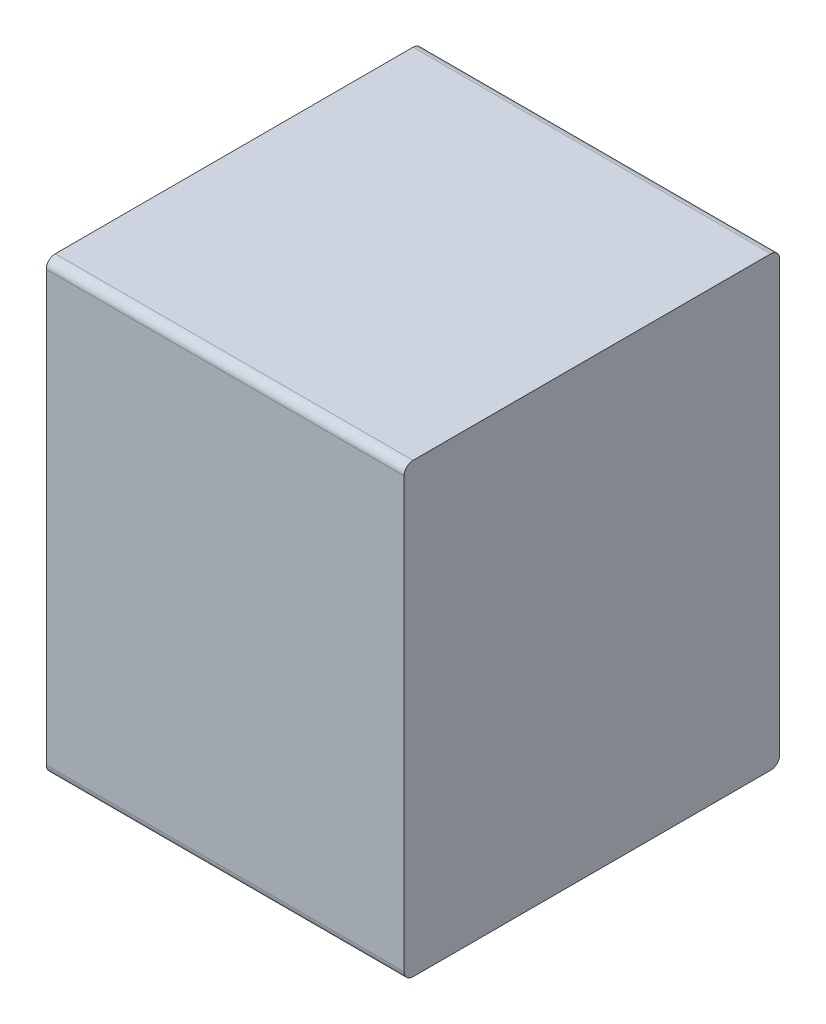
ISO-10303-21;
HEADER;
FILE_DESCRIPTION(('STEP AP214'),'2;1');
FILE_NAME('part.step','',(''),(''),'','','');
FILE_SCHEMA(('AUTOMOTIVE_DESIGN { 1 0 10303 214 1 1 1 1 }'));
ENDSEC;
DATA;
#1=APPLICATION_CONTEXT('core data for automotive mechanical design processes');
#2=APPLICATION_PROTOCOL_DEFINITION('international standard','automotive_design',2000,#1);
#3=PRODUCT_CONTEXT('',#1,'mechanical');
#4=PRODUCT('Part','Part','',(#3));
#5=PRODUCT_RELATED_PRODUCT_CATEGORY('part','',(#4));
#6=PRODUCT_DEFINITION_FORMATION('','',#4);
#7=PRODUCT_DEFINITION_CONTEXT('part definition',#1,'design');
#8=PRODUCT_DEFINITION('design','',#6,#7);
#9=PRODUCT_DEFINITION_SHAPE('','',#8);
#10=(LENGTH_UNIT() NAMED_UNIT(*) SI_UNIT(.MILLI.,.METRE.));
#11=(NAMED_UNIT(*) PLANE_ANGLE_UNIT() SI_UNIT($,.RADIAN.));
#12=(NAMED_UNIT(*) SI_UNIT($,.STERADIAN.) SOLID_ANGLE_UNIT());
#13=UNCERTAINTY_MEASURE_WITH_UNIT(LENGTH_MEASURE(1.E-05),#10,'distance_accuracy_value','');
#14=(GEOMETRIC_REPRESENTATION_CONTEXT(3) GLOBAL_UNCERTAINTY_ASSIGNED_CONTEXT((#13)) GLOBAL_UNIT_ASSIGNED_CONTEXT((#10,
#11,#12)) REPRESENTATION_CONTEXT('',''));
#15=CARTESIAN_POINT('',(0.,0.,0.));
#16=DIRECTION('',(0.,0.,1.));
#17=DIRECTION('',(1.,0.,0.));
#18=AXIS2_PLACEMENT_3D('',#15,#16,#17);
#19=CARTESIAN_POINT('',(-1.,-1.2,2.05));
#20=DIRECTION('',(1.,0.,0.));
#21=DIRECTION('',(0.,0.,1.));
#22=AXIS2_PLACEMENT_3D('',#19,#20,#21);
#23=CYLINDRICAL_SURFACE('',#22,0.0499999999999999);
#24=CARTESIAN_POINT('',(1.,-1.2,2.05));
#25=DIRECTION('',(1.,0.,0.));
#26=DIRECTION('',(0.,-0.707106781186548,0.707106781186548));
#27=AXIS2_PLACEMENT_3D('',#24,#25,#26);
#28=CIRCLE('',#27,0.0499999999999999);
#29=CARTESIAN_POINT('',(1.,-1.2,2.1));
#30=VERTEX_POINT('',#29);
#31=CARTESIAN_POINT('',(1.,-1.25,2.05));
#32=VERTEX_POINT('',#31);
#33=EDGE_CURVE('E11',#30,#32,#28,.T.);
#34=ORIENTED_EDGE('',*,*,#33,.F.);
#35=DIRECTION('',(1.,0.,0.));
#36=VECTOR('',#35,1.);
#37=CARTESIAN_POINT('',(-1.,-1.2,2.1));
#38=LINE('',#37,#36);
#39=CARTESIAN_POINT('',(-1.,-1.2,2.1));
#40=VERTEX_POINT('',#39);
#41=EDGE_CURVE('E24',#40,#30,#38,.T.);
#42=ORIENTED_EDGE('',*,*,#41,.F.);
#43=CARTESIAN_POINT('',(-1.,-1.2,2.05));
#44=DIRECTION('',(-1.,0.,0.));
#45=DIRECTION('',(0.,-0.707106781186548,0.707106781186548));
#46=AXIS2_PLACEMENT_3D('',#43,#44,#45);
#47=CIRCLE('',#46,0.0499999999999999);
#48=CARTESIAN_POINT('',(-1.,-1.25,2.05));
#49=VERTEX_POINT('',#48);
#50=EDGE_CURVE('E146',#49,#40,#47,.T.);
#51=ORIENTED_EDGE('',*,*,#50,.F.);
#52=DIRECTION('',(1.,0.,0.));
#53=VECTOR('',#52,1.);
#54=CARTESIAN_POINT('',(-1.,-1.25,2.05));
#55=LINE('',#54,#53);
#56=EDGE_CURVE('E144',#49,#32,#55,.T.);
#57=ORIENTED_EDGE('',*,*,#56,.T.);
#58=EDGE_LOOP('',(#34,#42,#51,#57));
#59=FACE_BOUND('',#58,.T.);
#60=ADVANCED_FACE('F17',(#59),#23,.T.);
#61=CARTESIAN_POINT('',(-1.,-1.2,0.0499999999999999));
#62=DIRECTION('',(1.,0.,0.));
#63=DIRECTION('',(0.,-1.,0.));
#64=AXIS2_PLACEMENT_3D('',#61,#62,#63);
#65=CYLINDRICAL_SURFACE('',#64,0.0499999999999999);
#66=CARTESIAN_POINT('',(1.,-1.2,0.0499999999999999));
#67=DIRECTION('',(1.,0.,0.));
#68=DIRECTION('',(0.,-0.707106781186548,-0.707106781186547));
#69=AXIS2_PLACEMENT_3D('',#66,#67,#68);
#70=CIRCLE('',#69,0.0499999999999999);
#71=CARTESIAN_POINT('',(1.,-1.25,0.0499999999999999));
#72=VERTEX_POINT('',#71);
#73=CARTESIAN_POINT('',(1.,-1.2,0.));
#74=VERTEX_POINT('',#73);
#75=EDGE_CURVE('E142',#72,#74,#70,.T.);
#76=ORIENTED_EDGE('',*,*,#75,.F.);
#77=DIRECTION('',(1.,0.,0.));
#78=VECTOR('',#77,1.);
#79=CARTESIAN_POINT('',(-1.,-1.25,0.0499999999999999));
#80=LINE('',#79,#78);
#81=CARTESIAN_POINT('',(-1.,-1.25,0.0499999999999999));
#82=VERTEX_POINT('',#81);
#83=EDGE_CURVE('E139',#82,#72,#80,.T.);
#84=ORIENTED_EDGE('',*,*,#83,.F.);
#85=CARTESIAN_POINT('',(-1.,-1.2,0.0499999999999999));
#86=DIRECTION('',(-1.,0.,0.));
#87=DIRECTION('',(0.,-0.707106781186548,-0.707106781186547));
#88=AXIS2_PLACEMENT_3D('',#85,#86,#87);
#89=CIRCLE('',#88,0.0499999999999999);
#90=CARTESIAN_POINT('',(-1.,-1.2,0.));
#91=VERTEX_POINT('',#90);
#92=EDGE_CURVE('E136',#91,#82,#89,.T.);
#93=ORIENTED_EDGE('',*,*,#92,.F.);
#94=DIRECTION('',(1.,0.,0.));
#95=VECTOR('',#94,1.);
#96=CARTESIAN_POINT('',(-1.,-1.2,0.));
#97=LINE('',#96,#95);
#98=EDGE_CURVE('E133',#91,#74,#97,.T.);
#99=ORIENTED_EDGE('',*,*,#98,.T.);
#100=EDGE_LOOP('',(#76,#84,#93,#99));
#101=FACE_BOUND('',#100,.T.);
#102=ADVANCED_FACE('F161',(#101),#65,.T.);
#103=CARTESIAN_POINT('',(-1.,1.2,2.1));
#104=DIRECTION('',(0.,0.,1.));
#105=DIRECTION('',(0.,-1.,0.));
#106=AXIS2_PLACEMENT_3D('',#103,#104,#105);
#107=PLANE('',#106);
#108=DIRECTION('',(0.,-1.,0.));
#109=VECTOR('',#108,1.);
#110=CARTESIAN_POINT('',(1.,1.25,2.1));
#111=LINE('',#110,#109);
#112=CARTESIAN_POINT('',(1.,1.2,2.1));
#113=VERTEX_POINT('',#112);
#114=EDGE_CURVE('E131',#113,#30,#111,.T.);
#115=ORIENTED_EDGE('',*,*,#114,.F.);
#116=DIRECTION('',(1.,0.,0.));
#117=VECTOR('',#116,1.);
#118=CARTESIAN_POINT('',(-1.,1.2,2.1));
#119=LINE('',#118,#117);
#120=CARTESIAN_POINT('',(-1.,1.2,2.1));
#121=VERTEX_POINT('',#120);
#122=EDGE_CURVE('E128',#121,#113,#119,.T.);
#123=ORIENTED_EDGE('',*,*,#122,.F.);
#124=DIRECTION('',(0.,1.,0.));
#125=VECTOR('',#124,1.);
#126=CARTESIAN_POINT('',(-1.,-1.25,2.1));
#127=LINE('',#126,#125);
#128=EDGE_CURVE('E126',#40,#121,#127,.T.);
#129=ORIENTED_EDGE('',*,*,#128,.F.);
#130=ORIENTED_EDGE('',*,*,#41,.T.);
#131=EDGE_LOOP('',(#115,#123,#129,#130));
#132=FACE_BOUND('',#131,.T.);
#133=ADVANCED_FACE('F150',(#132),#107,.T.);
#134=CARTESIAN_POINT('',(-1.,-1.2,0.));
#135=DIRECTION('',(0.,0.,-1.));
#136=DIRECTION('',(0.,1.,0.));
#137=AXIS2_PLACEMENT_3D('',#134,#135,#136);
#138=PLANE('',#137);
#139=DIRECTION('',(0.,-1.,0.));
#140=VECTOR('',#139,1.);
#141=CARTESIAN_POINT('',(1.,1.25,0.));
#142=LINE('',#141,#140);
#143=CARTESIAN_POINT('',(1.,1.2,0.));
#144=VERTEX_POINT('',#143);
#145=EDGE_CURVE('E123',#144,#74,#142,.T.);
#146=ORIENTED_EDGE('',*,*,#145,.T.);
#147=ORIENTED_EDGE('',*,*,#98,.F.);
#148=DIRECTION('',(0.,1.,0.));
#149=VECTOR('',#148,1.);
#150=CARTESIAN_POINT('',(-1.,-1.25,0.));
#151=LINE('',#150,#149);
#152=CARTESIAN_POINT('',(-1.,1.2,0.));
#153=VERTEX_POINT('',#152);
#154=EDGE_CURVE('E121',#91,#153,#151,.T.);
#155=ORIENTED_EDGE('',*,*,#154,.T.);
#156=DIRECTION('',(1.,0.,0.));
#157=VECTOR('',#156,1.);
#158=CARTESIAN_POINT('',(-1.,1.2,0.));
#159=LINE('',#158,#157);
#160=EDGE_CURVE('E86',#153,#144,#159,.T.);
#161=ORIENTED_EDGE('',*,*,#160,.T.);
#162=EDGE_LOOP('',(#146,#147,#155,#161));
#163=FACE_BOUND('',#162,.T.);
#164=ADVANCED_FACE('F163',(#163),#138,.T.);
#165=CARTESIAN_POINT('',(-1.,1.2,2.05));
#166=DIRECTION('',(1.,0.,0.));
#167=DIRECTION('',(0.,1.,0.));
#168=AXIS2_PLACEMENT_3D('',#165,#166,#167);
#169=CYLINDRICAL_SURFACE('',#168,0.0499999999999999);
#170=CARTESIAN_POINT('',(1.,1.2,2.05));
#171=DIRECTION('',(1.,0.,0.));
#172=DIRECTION('',(0.,0.707106781186548,0.707106781186548));
#173=AXIS2_PLACEMENT_3D('',#170,#171,#172);
#174=CIRCLE('',#173,0.0499999999999999);
#175=CARTESIAN_POINT('',(1.,1.25,2.05));
#176=VERTEX_POINT('',#175);
#177=EDGE_CURVE('E117',#176,#113,#174,.T.);
#178=ORIENTED_EDGE('',*,*,#177,.F.);
#179=DIRECTION('',(1.,0.,0.));
#180=VECTOR('',#179,1.);
#181=CARTESIAN_POINT('',(-1.,1.25,2.05));
#182=LINE('',#181,#180);
#183=CARTESIAN_POINT('',(-1.,1.25,2.05));
#184=VERTEX_POINT('',#183);
#185=EDGE_CURVE('E115',#184,#176,#182,.T.);
#186=ORIENTED_EDGE('',*,*,#185,.F.);
#187=CARTESIAN_POINT('',(-1.,1.2,2.05));
#188=DIRECTION('',(-1.,0.,0.));
#189=DIRECTION('',(0.,0.707106781186548,0.707106781186548));
#190=AXIS2_PLACEMENT_3D('',#187,#188,#189);
#191=CIRCLE('',#190,0.0499999999999999);
#192=EDGE_CURVE('E104',#121,#184,#191,.T.);
#193=ORIENTED_EDGE('',*,*,#192,.F.);
#194=ORIENTED_EDGE('',*,*,#122,.T.);
#195=EDGE_LOOP('',(#178,#186,#193,#194));
#196=FACE_BOUND('',#195,.T.);
#197=ADVANCED_FACE('F153',(#196),#169,.T.);
#198=CARTESIAN_POINT('',(-1.,1.2,0.0499999999999999));
#199=DIRECTION('',(1.,0.,0.));
#200=DIRECTION('',(0.,0.,-1.));
#201=AXIS2_PLACEMENT_3D('',#198,#199,#200);
#202=CYLINDRICAL_SURFACE('',#201,0.0499999999999999);
#203=CARTESIAN_POINT('',(1.,1.2,0.0499999999999999));
#204=DIRECTION('',(1.,0.,0.));
#205=DIRECTION('',(0.,0.707106781186548,-0.707106781186547));
#206=AXIS2_PLACEMENT_3D('',#203,#204,#205);
#207=CIRCLE('',#206,0.0499999999999999);
#208=CARTESIAN_POINT('',(1.,1.25,0.0499999999999999));
#209=VERTEX_POINT('',#208);
#210=EDGE_CURVE('E90',#144,#209,#207,.T.);
#211=ORIENTED_EDGE('',*,*,#210,.F.);
#212=ORIENTED_EDGE('',*,*,#160,.F.);
#213=CARTESIAN_POINT('',(-1.,1.2,0.0499999999999999));
#214=DIRECTION('',(-1.,0.,0.));
#215=DIRECTION('',(0.,0.707106781186548,-0.707106781186547));
#216=AXIS2_PLACEMENT_3D('',#213,#214,#215);
#217=CIRCLE('',#216,0.0499999999999999);
#218=CARTESIAN_POINT('',(-1.,1.25,0.0499999999999999));
#219=VERTEX_POINT('',#218);
#220=EDGE_CURVE('E79',#219,#153,#217,.T.);
#221=ORIENTED_EDGE('',*,*,#220,.F.);
#222=DIRECTION('',(1.,0.,0.));
#223=VECTOR('',#222,1.);
#224=CARTESIAN_POINT('',(-1.,1.25,0.0499999999999999));
#225=LINE('',#224,#223);
#226=EDGE_CURVE('E83',#219,#209,#225,.T.);
#227=ORIENTED_EDGE('',*,*,#226,.T.);
#228=EDGE_LOOP('',(#211,#212,#221,#227));
#229=FACE_BOUND('',#228,.T.);
#230=ADVANCED_FACE('F82',(#229),#202,.T.);
#231=CARTESIAN_POINT('',(-1.,1.25,0.0499999999999999));
#232=DIRECTION('',(0.,1.,0.));
#233=DIRECTION('',(0.,0.,1.));
#234=AXIS2_PLACEMENT_3D('',#231,#232,#233);
#235=PLANE('',#234);
#236=DIRECTION('',(0.,0.,1.));
#237=VECTOR('',#236,1.);
#238=CARTESIAN_POINT('',(1.,1.25,0.));
#239=LINE('',#238,#237);
#240=EDGE_CURVE('E98',#209,#176,#239,.T.);
#241=ORIENTED_EDGE('',*,*,#240,.F.);
#242=ORIENTED_EDGE('',*,*,#226,.F.);
#243=DIRECTION('',(0.,0.,1.));
#244=VECTOR('',#243,1.);
#245=CARTESIAN_POINT('',(-1.,1.25,0.));
#246=LINE('',#245,#244);
#247=EDGE_CURVE('E96',#219,#184,#246,.T.);
#248=ORIENTED_EDGE('',*,*,#247,.T.);
#249=ORIENTED_EDGE('',*,*,#185,.T.);
#250=EDGE_LOOP('',(#241,#242,#248,#249));
#251=FACE_BOUND('',#250,.T.);
#252=ADVANCED_FACE('F94',(#251),#235,.T.);
#253=CARTESIAN_POINT('',(-1.,-1.25,2.05));
#254=DIRECTION('',(0.,-1.,0.));
#255=DIRECTION('',(0.,0.,-1.));
#256=AXIS2_PLACEMENT_3D('',#253,#254,#255);
#257=PLANE('',#256);
#258=DIRECTION('',(0.,0.,1.));
#259=VECTOR('',#258,1.);
#260=CARTESIAN_POINT('',(1.,-1.25,0.));
#261=LINE('',#260,#259);
#262=EDGE_CURVE('E105',#72,#32,#261,.T.);
#263=ORIENTED_EDGE('',*,*,#262,.T.);
#264=ORIENTED_EDGE('',*,*,#56,.F.);
#265=DIRECTION('',(0.,0.,1.));
#266=VECTOR('',#265,1.);
#267=CARTESIAN_POINT('',(-1.,-1.25,0.));
#268=LINE('',#267,#266);
#269=EDGE_CURVE('E109',#82,#49,#268,.T.);
#270=ORIENTED_EDGE('',*,*,#269,.F.);
#271=ORIENTED_EDGE('',*,*,#83,.T.);
#272=EDGE_LOOP('',(#263,#264,#270,#271));
#273=FACE_BOUND('',#272,.T.);
#274=ADVANCED_FACE('F158',(#273),#257,.T.);
#275=CARTESIAN_POINT('',(-1.,-1.25,0.));
#276=DIRECTION('',(1.,0.,0.));
#277=DIRECTION('',(0.,1.,0.));
#278=AXIS2_PLACEMENT_3D('',#275,#276,#277);
#279=PLANE('',#278);
#280=ORIENTED_EDGE('',*,*,#220,.T.);
#281=ORIENTED_EDGE('',*,*,#154,.F.);
#282=ORIENTED_EDGE('',*,*,#92,.T.);
#283=ORIENTED_EDGE('',*,*,#269,.T.);
#284=ORIENTED_EDGE('',*,*,#50,.T.);
#285=ORIENTED_EDGE('',*,*,#128,.T.);
#286=ORIENTED_EDGE('',*,*,#192,.T.);
#287=ORIENTED_EDGE('',*,*,#247,.F.);
#288=EDGE_LOOP('',(#280,#281,#282,#283,#284,#285,#286,#287));
#289=FACE_BOUND('',#288,.T.);
#290=ADVANCED_FACE('F101',(#289),#279,.F.);
#291=CARTESIAN_POINT('',(1.,1.25,0.));
#292=DIRECTION('',(-1.,0.,0.));
#293=DIRECTION('',(0.,-1.,0.));
#294=AXIS2_PLACEMENT_3D('',#291,#292,#293);
#295=PLANE('',#294);
#296=ORIENTED_EDGE('',*,*,#75,.T.);
#297=ORIENTED_EDGE('',*,*,#145,.F.);
#298=ORIENTED_EDGE('',*,*,#210,.T.);
#299=ORIENTED_EDGE('',*,*,#240,.T.);
#300=ORIENTED_EDGE('',*,*,#177,.T.);
#301=ORIENTED_EDGE('',*,*,#114,.T.);
#302=ORIENTED_EDGE('',*,*,#33,.T.);
#303=ORIENTED_EDGE('',*,*,#262,.F.);
#304=EDGE_LOOP('',(#296,#297,#298,#299,#300,#301,#302,#303));
#305=FACE_BOUND('',#304,.T.);
#306=ADVANCED_FACE('F151',(#305),#295,.F.);
#307=CLOSED_SHELL('',(#60,#102,#133,#164,#197,#230,#252,#274,#290,#306));
#308=MANIFOLD_SOLID_BREP('B1',#307);
#309=ADVANCED_BREP_SHAPE_REPRESENTATION('',(#18,#308),#14);
#310=SHAPE_DEFINITION_REPRESENTATION(#9,#309);
ENDSEC;
END-ISO-10303-21;
